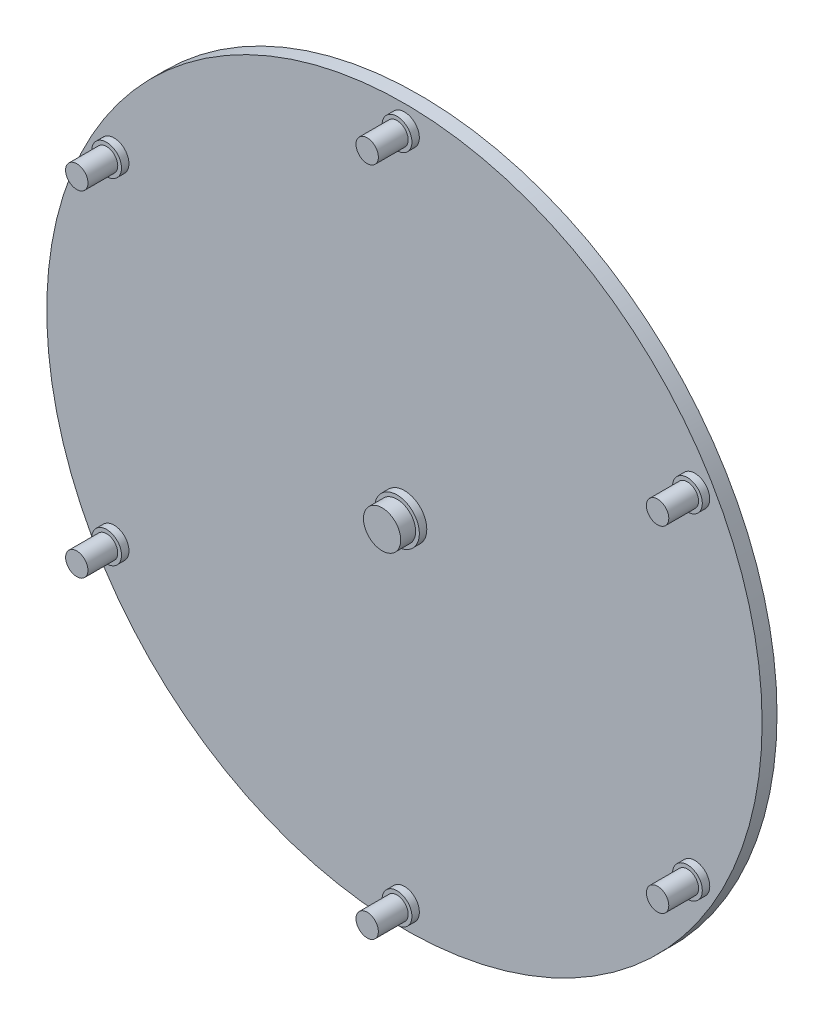
ISO-10303-21;
HEADER;
FILE_DESCRIPTION(('STEP AP214'),'2;1');
FILE_NAME('part.step','',(''),(''),'','','');
FILE_SCHEMA(('AUTOMOTIVE_DESIGN { 1 0 10303 214 1 1 1 1 }'));
ENDSEC;
DATA;
#1=APPLICATION_CONTEXT('core data for automotive mechanical design processes');
#2=APPLICATION_PROTOCOL_DEFINITION('international standard','automotive_design',2000,#1);
#3=PRODUCT_CONTEXT('',#1,'mechanical');
#4=PRODUCT('Part','Part','',(#3));
#5=PRODUCT_RELATED_PRODUCT_CATEGORY('part','',(#4));
#6=PRODUCT_DEFINITION_FORMATION('','',#4);
#7=PRODUCT_DEFINITION_CONTEXT('part definition',#1,'design');
#8=PRODUCT_DEFINITION('design','',#6,#7);
#9=PRODUCT_DEFINITION_SHAPE('','',#8);
#10=(LENGTH_UNIT() NAMED_UNIT(*) SI_UNIT(.MILLI.,.METRE.));
#11=(NAMED_UNIT(*) PLANE_ANGLE_UNIT() SI_UNIT($,.RADIAN.));
#12=(NAMED_UNIT(*) SI_UNIT($,.STERADIAN.) SOLID_ANGLE_UNIT());
#13=UNCERTAINTY_MEASURE_WITH_UNIT(LENGTH_MEASURE(1.E-05),#10,'distance_accuracy_value','');
#14=(GEOMETRIC_REPRESENTATION_CONTEXT(3) GLOBAL_UNCERTAINTY_ASSIGNED_CONTEXT((#13)) GLOBAL_UNIT_ASSIGNED_CONTEXT((#10,
#11,#12)) REPRESENTATION_CONTEXT('',''));
#15=CARTESIAN_POINT('',(0.,0.,0.));
#16=DIRECTION('',(0.,0.,1.));
#17=DIRECTION('',(1.,0.,0.));
#18=AXIS2_PLACEMENT_3D('',#15,#16,#17);
#19=CARTESIAN_POINT('',(0.,0.,4.));
#20=DIRECTION('',(0.,0.,-1.));
#21=DIRECTION('',(-1.,0.,0.));
#22=AXIS2_PLACEMENT_3D('',#19,#20,#21);
#23=CYLINDRICAL_SURFACE('',#22,96.);
#24=CARTESIAN_POINT('',(0.,0.,4.));
#25=DIRECTION('',(0.,0.,1.));
#26=DIRECTION('',(1.,0.,0.));
#27=AXIS2_PLACEMENT_3D('',#24,#25,#26);
#28=CIRCLE('',#27,96.);
#29=CARTESIAN_POINT('',(96.,0.,4.));
#30=VERTEX_POINT('',#29);
#31=EDGE_CURVE('E55',#30,#30,#28,.T.);
#32=ORIENTED_EDGE('',*,*,#31,.F.);
#33=EDGE_LOOP('',(#32));
#34=FACE_BOUND('',#33,.T.);
#35=CARTESIAN_POINT('',(0.,0.,0.));
#36=DIRECTION('',(0.,0.,1.));
#37=DIRECTION('',(1.,0.,0.));
#38=AXIS2_PLACEMENT_3D('',#35,#36,#37);
#39=CIRCLE('',#38,96.);
#40=CARTESIAN_POINT('',(96.,0.,0.));
#41=VERTEX_POINT('',#40);
#42=EDGE_CURVE('E59',#41,#41,#39,.T.);
#43=ORIENTED_EDGE('',*,*,#42,.T.);
#44=EDGE_LOOP('',(#43));
#45=FACE_BOUND('',#44,.T.);
#46=ADVANCED_FACE('F45',(#34,#45),#23,.T.);
#47=CARTESIAN_POINT('',(0.,0.,4.));
#48=DIRECTION('',(0.,0.,1.));
#49=DIRECTION('',(1.,0.,0.));
#50=AXIS2_PLACEMENT_3D('',#47,#48,#49);
#51=PLANE('',#50);
#52=CARTESIAN_POINT('',(-77.942286340599,45.0000000000009,4.));
#53=DIRECTION('',(0.,0.,1.));
#54=DIRECTION('',(0.50000000000001,0.866025403784433,0.));
#55=AXIS2_PLACEMENT_3D('',#52,#53,#54);
#56=CIRCLE('',#55,4.00000000000001);
#57=CARTESIAN_POINT('',(-75.9422863405989,48.4641016151386,4.));
#58=VERTEX_POINT('',#57);
#59=EDGE_CURVE('E143',#58,#58,#56,.T.);
#60=ORIENTED_EDGE('',*,*,#59,.F.);
#61=EDGE_LOOP('',(#60));
#62=FACE_BOUND('',#61,.T.);
#63=CARTESIAN_POINT('',(-77.9422863405999,-44.9999999999993,4.));
#64=DIRECTION('',(0.,0.,1.));
#65=DIRECTION('',(-0.499999999999992,0.866025403784443,0.));
#66=AXIS2_PLACEMENT_3D('',#63,#64,#65);
#67=CIRCLE('',#66,4.00000000000001);
#68=CARTESIAN_POINT('',(-79.9422863405999,-41.5358983848615,4.));
#69=VERTEX_POINT('',#68);
#70=EDGE_CURVE('E65',#69,#69,#67,.T.);
#71=ORIENTED_EDGE('',*,*,#70,.F.);
#72=EDGE_LOOP('',(#71));
#73=FACE_BOUND('',#72,.T.);
#74=CARTESIAN_POINT('',(0.,-90.,4.));
#75=DIRECTION('',(0.,0.,1.));
#76=DIRECTION('',(-1.,0.,0.));
#77=AXIS2_PLACEMENT_3D('',#74,#75,#76);
#78=CIRCLE('',#77,4.00000000000001);
#79=CARTESIAN_POINT('',(-4.00000000000001,-90.,4.));
#80=VERTEX_POINT('',#79);
#81=EDGE_CURVE('E70',#80,#80,#78,.T.);
#82=ORIENTED_EDGE('',*,*,#81,.F.);
#83=EDGE_LOOP('',(#82));
#84=FACE_BOUND('',#83,.T.);
#85=CARTESIAN_POINT('',(77.9422863405993,-45.0000000000004,4.));
#86=DIRECTION('',(0.,0.,1.));
#87=DIRECTION('',(-0.500000000000004,-0.866025403784436,0.));
#88=AXIS2_PLACEMENT_3D('',#85,#86,#87);
#89=CIRCLE('',#88,4.00000000000001);
#90=CARTESIAN_POINT('',(75.9422863405993,-48.4641016151381,4.));
#91=VERTEX_POINT('',#90);
#92=EDGE_CURVE('E75',#91,#91,#89,.T.);
#93=ORIENTED_EDGE('',*,*,#92,.F.);
#94=EDGE_LOOP('',(#93));
#95=FACE_BOUND('',#94,.T.);
#96=CARTESIAN_POINT('',(77.9422863405996,44.9999999999998,4.));
#97=DIRECTION('',(0.,0.,1.));
#98=DIRECTION('',(0.499999999999998,-0.86602540378444,0.));
#99=AXIS2_PLACEMENT_3D('',#96,#97,#98);
#100=CIRCLE('',#99,4.00000000000001);
#101=CARTESIAN_POINT('',(79.9422863405996,41.5358983848621,4.));
#102=VERTEX_POINT('',#101);
#103=EDGE_CURVE('E80',#102,#102,#100,.T.);
#104=ORIENTED_EDGE('',*,*,#103,.F.);
#105=EDGE_LOOP('',(#104));
#106=FACE_BOUND('',#105,.T.);
#107=CARTESIAN_POINT('',(0.,90.,4.));
#108=DIRECTION('',(0.,0.,1.));
#109=DIRECTION('',(1.,0.,0.));
#110=AXIS2_PLACEMENT_3D('',#107,#108,#109);
#111=CIRCLE('',#110,4.00000000000001);
#112=CARTESIAN_POINT('',(4.00000000000001,90.,4.));
#113=VERTEX_POINT('',#112);
#114=EDGE_CURVE('E85',#113,#113,#111,.T.);
#115=ORIENTED_EDGE('',*,*,#114,.F.);
#116=EDGE_LOOP('',(#115));
#117=FACE_BOUND('',#116,.T.);
#118=CARTESIAN_POINT('',(0.,0.,4.));
#119=DIRECTION('',(0.,0.,1.));
#120=DIRECTION('',(1.,0.,0.));
#121=AXIS2_PLACEMENT_3D('',#118,#119,#120);
#122=CIRCLE('',#121,6.);
#123=CARTESIAN_POINT('',(6.,0.,4.));
#124=VERTEX_POINT('',#123);
#125=EDGE_CURVE('E90',#124,#124,#122,.T.);
#126=ORIENTED_EDGE('',*,*,#125,.F.);
#127=EDGE_LOOP('',(#126));
#128=FACE_BOUND('',#127,.T.);
#129=ORIENTED_EDGE('',*,*,#31,.T.);
#130=EDGE_LOOP('',(#129));
#131=FACE_BOUND('',#130,.T.);
#132=ADVANCED_FACE('F181',(#62,#73,#84,#95,#106,#117,#128,#131),#51,.T.);
#133=CARTESIAN_POINT('',(0.,0.,0.));
#134=DIRECTION('',(0.,0.,1.));
#135=DIRECTION('',(1.,0.,0.));
#136=AXIS2_PLACEMENT_3D('',#133,#134,#135);
#137=PLANE('',#136);
#138=CARTESIAN_POINT('',(0.,0.,0.));
#139=DIRECTION('',(0.,0.,1.));
#140=DIRECTION('',(1.,0.,0.));
#141=AXIS2_PLACEMENT_3D('',#138,#139,#140);
#142=CIRCLE('',#141,7.);
#143=CARTESIAN_POINT('',(7.,0.,0.));
#144=VERTEX_POINT('',#143);
#145=EDGE_CURVE('E51',#144,#144,#142,.F.);
#146=ORIENTED_EDGE('',*,*,#145,.F.);
#147=EDGE_LOOP('',(#146));
#148=FACE_BOUND('',#147,.T.);
#149=ORIENTED_EDGE('',*,*,#42,.F.);
#150=EDGE_LOOP('',(#149));
#151=FACE_BOUND('',#150,.T.);
#152=ADVANCED_FACE('F187',(#148,#151),#137,.F.);
#153=CARTESIAN_POINT('',(0.,0.,6.));
#154=DIRECTION('',(0.,0.,-1.));
#155=DIRECTION('',(-1.,0.,0.));
#156=AXIS2_PLACEMENT_3D('',#153,#154,#155);
#157=CYLINDRICAL_SURFACE('',#156,6.);
#158=CARTESIAN_POINT('',(0.,0.,6.));
#159=DIRECTION('',(0.,0.,1.));
#160=DIRECTION('',(1.,0.,0.));
#161=AXIS2_PLACEMENT_3D('',#158,#159,#160);
#162=CIRCLE('',#161,6.);
#163=CARTESIAN_POINT('',(6.,0.,6.));
#164=VERTEX_POINT('',#163);
#165=EDGE_CURVE('E96',#164,#164,#162,.T.);
#166=ORIENTED_EDGE('',*,*,#165,.F.);
#167=EDGE_LOOP('',(#166));
#168=FACE_BOUND('',#167,.T.);
#169=ORIENTED_EDGE('',*,*,#125,.T.);
#170=EDGE_LOOP('',(#169));
#171=FACE_BOUND('',#170,.T.);
#172=ADVANCED_FACE('F195',(#168,#171),#157,.T.);
#173=CARTESIAN_POINT('',(0.,0.,6.));
#174=DIRECTION('',(0.,0.,1.));
#175=DIRECTION('',(1.,0.,0.));
#176=AXIS2_PLACEMENT_3D('',#173,#174,#175);
#177=PLANE('',#176);
#178=CARTESIAN_POINT('',(0.,0.,6.));
#179=DIRECTION('',(0.,0.,1.));
#180=DIRECTION('',(1.,0.,0.));
#181=AXIS2_PLACEMENT_3D('',#178,#179,#180);
#182=CIRCLE('',#181,5.);
#183=CARTESIAN_POINT('',(5.,0.,6.));
#184=VERTEX_POINT('',#183);
#185=EDGE_CURVE('E92',#184,#184,#182,.T.);
#186=ORIENTED_EDGE('',*,*,#185,.F.);
#187=EDGE_LOOP('',(#186));
#188=FACE_BOUND('',#187,.T.);
#189=ORIENTED_EDGE('',*,*,#165,.T.);
#190=EDGE_LOOP('',(#189));
#191=FACE_BOUND('',#190,.T.);
#192=ADVANCED_FACE('F202',(#188,#191),#177,.T.);
#193=CARTESIAN_POINT('',(0.,0.,10.));
#194=DIRECTION('',(0.,0.,1.));
#195=DIRECTION('',(1.,0.,0.));
#196=AXIS2_PLACEMENT_3D('',#193,#194,#195);
#197=PLANE('',#196);
#198=CARTESIAN_POINT('',(0.,0.,10.));
#199=DIRECTION('',(0.,0.,1.));
#200=DIRECTION('',(1.,0.,0.));
#201=AXIS2_PLACEMENT_3D('',#198,#199,#200);
#202=CIRCLE('',#201,5.);
#203=CARTESIAN_POINT('',(5.,0.,10.));
#204=VERTEX_POINT('',#203);
#205=EDGE_CURVE('E98',#204,#204,#202,.T.);
#206=ORIENTED_EDGE('',*,*,#205,.T.);
#207=EDGE_LOOP('',(#206));
#208=FACE_BOUND('',#207,.T.);
#209=ADVANCED_FACE('F210',(#208),#197,.T.);
#210=CARTESIAN_POINT('',(0.,0.,10.));
#211=DIRECTION('',(0.,0.,-1.));
#212=DIRECTION('',(-1.,0.,0.));
#213=AXIS2_PLACEMENT_3D('',#210,#211,#212);
#214=CYLINDRICAL_SURFACE('',#213,5.);
#215=ORIENTED_EDGE('',*,*,#185,.T.);
#216=EDGE_LOOP('',(#215));
#217=FACE_BOUND('',#216,.T.);
#218=ORIENTED_EDGE('',*,*,#205,.F.);
#219=EDGE_LOOP('',(#218));
#220=FACE_BOUND('',#219,.T.);
#221=ADVANCED_FACE('F206',(#217,#220),#214,.T.);
#222=CARTESIAN_POINT('',(0.,90.,6.));
#223=DIRECTION('',(0.,0.,-1.));
#224=DIRECTION('',(-1.,0.,0.));
#225=AXIS2_PLACEMENT_3D('',#222,#223,#224);
#226=CYLINDRICAL_SURFACE('',#225,4.00000000000001);
#227=CARTESIAN_POINT('',(0.,90.,6.));
#228=DIRECTION('',(0.,0.,1.));
#229=DIRECTION('',(1.,0.,0.));
#230=AXIS2_PLACEMENT_3D('',#227,#228,#229);
#231=CIRCLE('',#230,4.00000000000001);
#232=CARTESIAN_POINT('',(4.00000000000001,90.,6.));
#233=VERTEX_POINT('',#232);
#234=EDGE_CURVE('E91',#233,#233,#231,.T.);
#235=ORIENTED_EDGE('',*,*,#234,.F.);
#236=EDGE_LOOP('',(#235));
#237=FACE_BOUND('',#236,.T.);
#238=ORIENTED_EDGE('',*,*,#114,.T.);
#239=EDGE_LOOP('',(#238));
#240=FACE_BOUND('',#239,.T.);
#241=ADVANCED_FACE('F209',(#237,#240),#226,.T.);
#242=CARTESIAN_POINT('',(0.,90.,6.));
#243=DIRECTION('',(0.,0.,1.));
#244=DIRECTION('',(1.,0.,0.));
#245=AXIS2_PLACEMENT_3D('',#242,#243,#244);
#246=PLANE('',#245);
#247=CARTESIAN_POINT('',(0.,90.,6.));
#248=DIRECTION('',(0.,0.,1.));
#249=DIRECTION('',(1.,0.,0.));
#250=AXIS2_PLACEMENT_3D('',#247,#248,#249);
#251=CIRCLE('',#250,3.);
#252=CARTESIAN_POINT('',(3.,90.,6.));
#253=VERTEX_POINT('',#252);
#254=EDGE_CURVE('E87',#253,#253,#251,.T.);
#255=ORIENTED_EDGE('',*,*,#254,.F.);
#256=EDGE_LOOP('',(#255));
#257=FACE_BOUND('',#256,.T.);
#258=ORIENTED_EDGE('',*,*,#234,.T.);
#259=EDGE_LOOP('',(#258));
#260=FACE_BOUND('',#259,.T.);
#261=ADVANCED_FACE('F222',(#257,#260),#246,.T.);
#262=CARTESIAN_POINT('',(0.,90.,14.));
#263=DIRECTION('',(0.,0.,1.));
#264=DIRECTION('',(1.,0.,0.));
#265=AXIS2_PLACEMENT_3D('',#262,#263,#264);
#266=PLANE('',#265);
#267=CARTESIAN_POINT('',(0.,90.,14.));
#268=DIRECTION('',(0.,0.,1.));
#269=DIRECTION('',(1.,0.,0.));
#270=AXIS2_PLACEMENT_3D('',#267,#268,#269);
#271=CIRCLE('',#270,3.);
#272=CARTESIAN_POINT('',(3.,90.,14.));
#273=VERTEX_POINT('',#272);
#274=EDGE_CURVE('E102',#273,#273,#271,.T.);
#275=ORIENTED_EDGE('',*,*,#274,.T.);
#276=EDGE_LOOP('',(#275));
#277=FACE_BOUND('',#276,.T.);
#278=ADVANCED_FACE('F218',(#277),#266,.T.);
#279=CARTESIAN_POINT('',(0.,90.,14.));
#280=DIRECTION('',(0.,0.,-1.));
#281=DIRECTION('',(-1.,0.,0.));
#282=AXIS2_PLACEMENT_3D('',#279,#280,#281);
#283=CYLINDRICAL_SURFACE('',#282,3.);
#284=ORIENTED_EDGE('',*,*,#254,.T.);
#285=EDGE_LOOP('',(#284));
#286=FACE_BOUND('',#285,.T.);
#287=ORIENTED_EDGE('',*,*,#274,.F.);
#288=EDGE_LOOP('',(#287));
#289=FACE_BOUND('',#288,.T.);
#290=ADVANCED_FACE('F214',(#286,#289),#283,.T.);
#291=CARTESIAN_POINT('',(77.9422863405996,44.9999999999998,6.));
#292=DIRECTION('',(0.,0.,-1.));
#293=DIRECTION('',(-1.,0.,0.));
#294=AXIS2_PLACEMENT_3D('',#291,#292,#293);
#295=CYLINDRICAL_SURFACE('',#294,4.00000000000001);
#296=CARTESIAN_POINT('',(77.9422863405996,44.9999999999998,6.));
#297=DIRECTION('',(0.,0.,1.));
#298=DIRECTION('',(0.499999999999998,-0.86602540378444,0.));
#299=AXIS2_PLACEMENT_3D('',#296,#297,#298);
#300=CIRCLE('',#299,4.00000000000001);
#301=CARTESIAN_POINT('',(79.9422863405996,41.5358983848621,6.));
#302=VERTEX_POINT('',#301);
#303=EDGE_CURVE('E86',#302,#302,#300,.T.);
#304=ORIENTED_EDGE('',*,*,#303,.F.);
#305=EDGE_LOOP('',(#304));
#306=FACE_BOUND('',#305,.T.);
#307=ORIENTED_EDGE('',*,*,#103,.T.);
#308=EDGE_LOOP('',(#307));
#309=FACE_BOUND('',#308,.T.);
#310=ADVANCED_FACE('F217',(#306,#309),#295,.T.);
#311=CARTESIAN_POINT('',(77.9422863405996,44.9999999999998,6.));
#312=DIRECTION('',(0.,0.,1.));
#313=DIRECTION('',(0.499999999999998,-0.86602540378444,0.));
#314=AXIS2_PLACEMENT_3D('',#311,#312,#313);
#315=PLANE('',#314);
#316=CARTESIAN_POINT('',(77.942286340599,45.0000000000009,6.));
#317=DIRECTION('',(0.,0.,1.));
#318=DIRECTION('',(1.,0.,0.));
#319=AXIS2_PLACEMENT_3D('',#316,#317,#318);
#320=CIRCLE('',#319,3.);
#321=CARTESIAN_POINT('',(80.942286340599,45.0000000000009,6.));
#322=VERTEX_POINT('',#321);
#323=EDGE_CURVE('E82',#322,#322,#320,.T.);
#324=ORIENTED_EDGE('',*,*,#323,.F.);
#325=EDGE_LOOP('',(#324));
#326=FACE_BOUND('',#325,.T.);
#327=ORIENTED_EDGE('',*,*,#303,.T.);
#328=EDGE_LOOP('',(#327));
#329=FACE_BOUND('',#328,.T.);
#330=ADVANCED_FACE('F269',(#326,#329),#315,.T.);
#331=CARTESIAN_POINT('',(77.942286340599,45.0000000000009,14.));
#332=DIRECTION('',(0.,0.,1.));
#333=DIRECTION('',(0.50000000000001,-0.866025403784433,0.));
#334=AXIS2_PLACEMENT_3D('',#331,#332,#333);
#335=PLANE('',#334);
#336=CARTESIAN_POINT('',(77.942286340599,45.0000000000009,14.));
#337=DIRECTION('',(0.,0.,1.));
#338=DIRECTION('',(0.50000000000001,-0.866025403784433,0.));
#339=AXIS2_PLACEMENT_3D('',#336,#337,#338);
#340=CIRCLE('',#339,3.);
#341=CARTESIAN_POINT('',(79.442286340599,42.4019237886476,14.));
#342=VERTEX_POINT('',#341);
#343=EDGE_CURVE('E95',#342,#342,#340,.T.);
#344=ORIENTED_EDGE('',*,*,#343,.T.);
#345=EDGE_LOOP('',(#344));
#346=FACE_BOUND('',#345,.T.);
#347=ADVANCED_FACE('F266',(#346),#335,.T.);
#348=CARTESIAN_POINT('',(77.942286340599,45.0000000000009,14.));
#349=DIRECTION('',(0.,0.,-1.));
#350=DIRECTION('',(-1.,0.,0.));
#351=AXIS2_PLACEMENT_3D('',#348,#349,#350);
#352=CYLINDRICAL_SURFACE('',#351,3.);
#353=ORIENTED_EDGE('',*,*,#323,.T.);
#354=EDGE_LOOP('',(#353));
#355=FACE_BOUND('',#354,.T.);
#356=ORIENTED_EDGE('',*,*,#343,.F.);
#357=EDGE_LOOP('',(#356));
#358=FACE_BOUND('',#357,.T.);
#359=ADVANCED_FACE('F262',(#355,#358),#352,.T.);
#360=CARTESIAN_POINT('',(77.9422863405993,-45.0000000000004,6.));
#361=DIRECTION('',(0.,0.,-1.));
#362=DIRECTION('',(-1.,0.,0.));
#363=AXIS2_PLACEMENT_3D('',#360,#361,#362);
#364=CYLINDRICAL_SURFACE('',#363,4.00000000000001);
#365=CARTESIAN_POINT('',(77.9422863405993,-45.0000000000004,6.));
#366=DIRECTION('',(0.,0.,1.));
#367=DIRECTION('',(-0.500000000000004,-0.866025403784436,0.));
#368=AXIS2_PLACEMENT_3D('',#365,#366,#367);
#369=CIRCLE('',#368,4.00000000000001);
#370=CARTESIAN_POINT('',(75.9422863405993,-48.4641016151381,6.));
#371=VERTEX_POINT('',#370);
#372=EDGE_CURVE('E81',#371,#371,#369,.T.);
#373=ORIENTED_EDGE('',*,*,#372,.F.);
#374=EDGE_LOOP('',(#373));
#375=FACE_BOUND('',#374,.T.);
#376=ORIENTED_EDGE('',*,*,#92,.T.);
#377=EDGE_LOOP('',(#376));
#378=FACE_BOUND('',#377,.T.);
#379=ADVANCED_FACE('F265',(#375,#378),#364,.T.);
#380=CARTESIAN_POINT('',(77.9422863405993,-45.0000000000004,6.));
#381=DIRECTION('',(0.,0.,1.));
#382=DIRECTION('',(-0.500000000000004,-0.866025403784436,0.));
#383=AXIS2_PLACEMENT_3D('',#380,#381,#382);
#384=PLANE('',#383);
#385=CARTESIAN_POINT('',(77.9422863405999,-44.9999999999993,6.));
#386=DIRECTION('',(0.,0.,1.));
#387=DIRECTION('',(1.,0.,0.));
#388=AXIS2_PLACEMENT_3D('',#385,#386,#387);
#389=CIRCLE('',#388,3.);
#390=CARTESIAN_POINT('',(80.9422863405999,-44.9999999999993,6.));
#391=VERTEX_POINT('',#390);
#392=EDGE_CURVE('E77',#391,#391,#389,.T.);
#393=ORIENTED_EDGE('',*,*,#392,.F.);
#394=EDGE_LOOP('',(#393));
#395=FACE_BOUND('',#394,.T.);
#396=ORIENTED_EDGE('',*,*,#372,.T.);
#397=EDGE_LOOP('',(#396));
#398=FACE_BOUND('',#397,.T.);
#399=ADVANCED_FACE('F260',(#395,#398),#384,.T.);
#400=CARTESIAN_POINT('',(77.9422863405999,-44.9999999999993,14.));
#401=DIRECTION('',(0.,0.,1.));
#402=DIRECTION('',(-0.499999999999992,-0.866025403784443,0.));
#403=AXIS2_PLACEMENT_3D('',#400,#401,#402);
#404=PLANE('',#403);
#405=CARTESIAN_POINT('',(77.9422863405999,-44.9999999999993,14.));
#406=DIRECTION('',(0.,0.,1.));
#407=DIRECTION('',(-0.499999999999992,-0.866025403784443,0.));
#408=AXIS2_PLACEMENT_3D('',#405,#406,#407);
#409=CIRCLE('',#408,3.);
#410=CARTESIAN_POINT('',(76.4422863405999,-47.5980762113526,14.));
#411=VERTEX_POINT('',#410);
#412=EDGE_CURVE('E114',#411,#411,#409,.T.);
#413=ORIENTED_EDGE('',*,*,#412,.T.);
#414=EDGE_LOOP('',(#413));
#415=FACE_BOUND('',#414,.T.);
#416=ADVANCED_FACE('F256',(#415),#404,.T.);
#417=CARTESIAN_POINT('',(77.9422863405999,-44.9999999999993,14.));
#418=DIRECTION('',(0.,0.,-1.));
#419=DIRECTION('',(-1.,0.,0.));
#420=AXIS2_PLACEMENT_3D('',#417,#418,#419);
#421=CYLINDRICAL_SURFACE('',#420,3.);
#422=ORIENTED_EDGE('',*,*,#392,.T.);
#423=EDGE_LOOP('',(#422));
#424=FACE_BOUND('',#423,.T.);
#425=ORIENTED_EDGE('',*,*,#412,.F.);
#426=EDGE_LOOP('',(#425));
#427=FACE_BOUND('',#426,.T.);
#428=ADVANCED_FACE('F252',(#424,#427),#421,.T.);
#429=CARTESIAN_POINT('',(0.,-90.,6.));
#430=DIRECTION('',(0.,0.,-1.));
#431=DIRECTION('',(-1.,0.,0.));
#432=AXIS2_PLACEMENT_3D('',#429,#430,#431);
#433=CYLINDRICAL_SURFACE('',#432,4.00000000000001);
#434=CARTESIAN_POINT('',(0.,-90.,6.));
#435=DIRECTION('',(0.,0.,1.));
#436=DIRECTION('',(-1.,0.,0.));
#437=AXIS2_PLACEMENT_3D('',#434,#435,#436);
#438=CIRCLE('',#437,4.00000000000001);
#439=CARTESIAN_POINT('',(-4.00000000000001,-90.,6.));
#440=VERTEX_POINT('',#439);
#441=EDGE_CURVE('E76',#440,#440,#438,.T.);
#442=ORIENTED_EDGE('',*,*,#441,.F.);
#443=EDGE_LOOP('',(#442));
#444=FACE_BOUND('',#443,.T.);
#445=ORIENTED_EDGE('',*,*,#81,.T.);
#446=EDGE_LOOP('',(#445));
#447=FACE_BOUND('',#446,.T.);
#448=ADVANCED_FACE('F255',(#444,#447),#433,.T.);
#449=CARTESIAN_POINT('',(0.,-90.,6.));
#450=DIRECTION('',(0.,0.,1.));
#451=DIRECTION('',(-1.,0.,0.));
#452=AXIS2_PLACEMENT_3D('',#449,#450,#451);
#453=PLANE('',#452);
#454=CARTESIAN_POINT('',(0.,-90.,6.));
#455=DIRECTION('',(0.,0.,1.));
#456=DIRECTION('',(1.,0.,0.));
#457=AXIS2_PLACEMENT_3D('',#454,#455,#456);
#458=CIRCLE('',#457,3.);
#459=CARTESIAN_POINT('',(3.,-90.,6.));
#460=VERTEX_POINT('',#459);
#461=EDGE_CURVE('E72',#460,#460,#458,.T.);
#462=ORIENTED_EDGE('',*,*,#461,.F.);
#463=EDGE_LOOP('',(#462));
#464=FACE_BOUND('',#463,.T.);
#465=ORIENTED_EDGE('',*,*,#441,.T.);
#466=EDGE_LOOP('',(#465));
#467=FACE_BOUND('',#466,.T.);
#468=ADVANCED_FACE('F250',(#464,#467),#453,.T.);
#469=CARTESIAN_POINT('',(0.,-90.,14.));
#470=DIRECTION('',(0.,0.,1.));
#471=DIRECTION('',(-1.,0.,0.));
#472=AXIS2_PLACEMENT_3D('',#469,#470,#471);
#473=PLANE('',#472);
#474=CARTESIAN_POINT('',(0.,-90.,14.));
#475=DIRECTION('',(0.,0.,1.));
#476=DIRECTION('',(-1.,0.,0.));
#477=AXIS2_PLACEMENT_3D('',#474,#475,#476);
#478=CIRCLE('',#477,3.);
#479=CARTESIAN_POINT('',(-3.,-90.,14.));
#480=VERTEX_POINT('',#479);
#481=EDGE_CURVE('E111',#480,#480,#478,.T.);
#482=ORIENTED_EDGE('',*,*,#481,.T.);
#483=EDGE_LOOP('',(#482));
#484=FACE_BOUND('',#483,.T.);
#485=ADVANCED_FACE('F246',(#484),#473,.T.);
#486=CARTESIAN_POINT('',(0.,-90.,14.));
#487=DIRECTION('',(0.,0.,-1.));
#488=DIRECTION('',(-1.,0.,0.));
#489=AXIS2_PLACEMENT_3D('',#486,#487,#488);
#490=CYLINDRICAL_SURFACE('',#489,3.);
#491=ORIENTED_EDGE('',*,*,#461,.T.);
#492=EDGE_LOOP('',(#491));
#493=FACE_BOUND('',#492,.T.);
#494=ORIENTED_EDGE('',*,*,#481,.F.);
#495=EDGE_LOOP('',(#494));
#496=FACE_BOUND('',#495,.T.);
#497=ADVANCED_FACE('F242',(#493,#496),#490,.T.);
#498=CARTESIAN_POINT('',(-77.9422863405999,-44.9999999999993,6.));
#499=DIRECTION('',(0.,0.,-1.));
#500=DIRECTION('',(-1.,0.,0.));
#501=AXIS2_PLACEMENT_3D('',#498,#499,#500);
#502=CYLINDRICAL_SURFACE('',#501,4.00000000000001);
#503=CARTESIAN_POINT('',(-77.9422863405999,-44.9999999999993,6.));
#504=DIRECTION('',(0.,0.,1.));
#505=DIRECTION('',(-0.499999999999992,0.866025403784443,0.));
#506=AXIS2_PLACEMENT_3D('',#503,#504,#505);
#507=CIRCLE('',#506,4.00000000000001);
#508=CARTESIAN_POINT('',(-79.9422863405999,-41.5358983848615,6.));
#509=VERTEX_POINT('',#508);
#510=EDGE_CURVE('E71',#509,#509,#507,.T.);
#511=ORIENTED_EDGE('',*,*,#510,.F.);
#512=EDGE_LOOP('',(#511));
#513=FACE_BOUND('',#512,.T.);
#514=ORIENTED_EDGE('',*,*,#70,.T.);
#515=EDGE_LOOP('',(#514));
#516=FACE_BOUND('',#515,.T.);
#517=ADVANCED_FACE('F245',(#513,#516),#502,.T.);
#518=CARTESIAN_POINT('',(-77.9422863405999,-44.9999999999993,6.));
#519=DIRECTION('',(0.,0.,1.));
#520=DIRECTION('',(-0.499999999999992,0.866025403784443,0.));
#521=AXIS2_PLACEMENT_3D('',#518,#519,#520);
#522=PLANE('',#521);
#523=CARTESIAN_POINT('',(-77.9422863405993,-45.0000000000004,6.));
#524=DIRECTION('',(0.,0.,1.));
#525=DIRECTION('',(1.,0.,0.));
#526=AXIS2_PLACEMENT_3D('',#523,#524,#525);
#527=CIRCLE('',#526,3.);
#528=CARTESIAN_POINT('',(-74.9422863405993,-45.0000000000004,6.));
#529=VERTEX_POINT('',#528);
#530=EDGE_CURVE('E67',#529,#529,#527,.T.);
#531=ORIENTED_EDGE('',*,*,#530,.F.);
#532=EDGE_LOOP('',(#531));
#533=FACE_BOUND('',#532,.T.);
#534=ORIENTED_EDGE('',*,*,#510,.T.);
#535=EDGE_LOOP('',(#534));
#536=FACE_BOUND('',#535,.T.);
#537=ADVANCED_FACE('F240',(#533,#536),#522,.T.);
#538=CARTESIAN_POINT('',(-77.9422863405993,-45.0000000000004,14.));
#539=DIRECTION('',(0.,0.,1.));
#540=DIRECTION('',(-0.500000000000004,0.866025403784436,0.));
#541=AXIS2_PLACEMENT_3D('',#538,#539,#540);
#542=PLANE('',#541);
#543=CARTESIAN_POINT('',(-77.9422863405993,-45.0000000000004,14.));
#544=DIRECTION('',(0.,0.,1.));
#545=DIRECTION('',(-0.500000000000004,0.866025403784436,0.));
#546=AXIS2_PLACEMENT_3D('',#543,#544,#545);
#547=CIRCLE('',#546,3.);
#548=CARTESIAN_POINT('',(-79.4422863405993,-42.4019237886471,14.));
#549=VERTEX_POINT('',#548);
#550=EDGE_CURVE('E108',#549,#549,#547,.T.);
#551=ORIENTED_EDGE('',*,*,#550,.T.);
#552=EDGE_LOOP('',(#551));
#553=FACE_BOUND('',#552,.T.);
#554=ADVANCED_FACE('F236',(#553),#542,.T.);
#555=CARTESIAN_POINT('',(-77.9422863405993,-45.0000000000004,14.));
#556=DIRECTION('',(0.,0.,-1.));
#557=DIRECTION('',(-1.,0.,0.));
#558=AXIS2_PLACEMENT_3D('',#555,#556,#557);
#559=CYLINDRICAL_SURFACE('',#558,3.);
#560=ORIENTED_EDGE('',*,*,#530,.T.);
#561=EDGE_LOOP('',(#560));
#562=FACE_BOUND('',#561,.T.);
#563=ORIENTED_EDGE('',*,*,#550,.F.);
#564=EDGE_LOOP('',(#563));
#565=FACE_BOUND('',#564,.T.);
#566=ADVANCED_FACE('F232',(#562,#565),#559,.T.);
#567=CARTESIAN_POINT('',(-77.942286340599,45.0000000000009,6.));
#568=DIRECTION('',(0.,0.,-1.));
#569=DIRECTION('',(-1.,0.,0.));
#570=AXIS2_PLACEMENT_3D('',#567,#568,#569);
#571=CYLINDRICAL_SURFACE('',#570,4.00000000000001);
#572=CARTESIAN_POINT('',(-77.942286340599,45.0000000000009,6.));
#573=DIRECTION('',(0.,0.,1.));
#574=DIRECTION('',(0.50000000000001,0.866025403784433,0.));
#575=AXIS2_PLACEMENT_3D('',#572,#573,#574);
#576=CIRCLE('',#575,4.00000000000001);
#577=CARTESIAN_POINT('',(-75.9422863405989,48.4641016151386,6.));
#578=VERTEX_POINT('',#577);
#579=EDGE_CURVE('E66',#578,#578,#576,.T.);
#580=ORIENTED_EDGE('',*,*,#579,.F.);
#581=EDGE_LOOP('',(#580));
#582=FACE_BOUND('',#581,.T.);
#583=ORIENTED_EDGE('',*,*,#59,.T.);
#584=EDGE_LOOP('',(#583));
#585=FACE_BOUND('',#584,.T.);
#586=ADVANCED_FACE('F235',(#582,#585),#571,.T.);
#587=CARTESIAN_POINT('',(-77.942286340599,45.0000000000009,6.));
#588=DIRECTION('',(0.,0.,1.));
#589=DIRECTION('',(0.50000000000001,0.866025403784433,0.));
#590=AXIS2_PLACEMENT_3D('',#587,#588,#589);
#591=PLANE('',#590);
#592=CARTESIAN_POINT('',(-77.9422863405996,44.9999999999998,6.));
#593=DIRECTION('',(0.,0.,1.));
#594=DIRECTION('',(1.,0.,0.));
#595=AXIS2_PLACEMENT_3D('',#592,#593,#594);
#596=CIRCLE('',#595,3.);
#597=CARTESIAN_POINT('',(-74.9422863405996,44.9999999999998,6.));
#598=VERTEX_POINT('',#597);
#599=EDGE_CURVE('E62',#598,#598,#596,.T.);
#600=ORIENTED_EDGE('',*,*,#599,.F.);
#601=EDGE_LOOP('',(#600));
#602=FACE_BOUND('',#601,.T.);
#603=ORIENTED_EDGE('',*,*,#579,.T.);
#604=EDGE_LOOP('',(#603));
#605=FACE_BOUND('',#604,.T.);
#606=ADVANCED_FACE('F230',(#602,#605),#591,.T.);
#607=CARTESIAN_POINT('',(-77.9422863405996,44.9999999999998,14.));
#608=DIRECTION('',(0.,0.,1.));
#609=DIRECTION('',(0.499999999999998,0.86602540378444,0.));
#610=AXIS2_PLACEMENT_3D('',#607,#608,#609);
#611=PLANE('',#610);
#612=CARTESIAN_POINT('',(-77.9422863405996,44.9999999999998,14.));
#613=DIRECTION('',(0.,0.,1.));
#614=DIRECTION('',(0.499999999999998,0.86602540378444,0.));
#615=AXIS2_PLACEMENT_3D('',#612,#613,#614);
#616=CIRCLE('',#615,3.);
#617=CARTESIAN_POINT('',(-76.4422863405996,47.5980762113531,14.));
#618=VERTEX_POINT('',#617);
#619=EDGE_CURVE('E105',#618,#618,#616,.T.);
#620=ORIENTED_EDGE('',*,*,#619,.T.);
#621=EDGE_LOOP('',(#620));
#622=FACE_BOUND('',#621,.T.);
#623=ADVANCED_FACE('F226',(#622),#611,.T.);
#624=CARTESIAN_POINT('',(-77.9422863405996,44.9999999999998,14.));
#625=DIRECTION('',(0.,0.,-1.));
#626=DIRECTION('',(-1.,0.,0.));
#627=AXIS2_PLACEMENT_3D('',#624,#625,#626);
#628=CYLINDRICAL_SURFACE('',#627,3.);
#629=ORIENTED_EDGE('',*,*,#599,.T.);
#630=EDGE_LOOP('',(#629));
#631=FACE_BOUND('',#630,.T.);
#632=ORIENTED_EDGE('',*,*,#619,.F.);
#633=EDGE_LOOP('',(#632));
#634=FACE_BOUND('',#633,.T.);
#635=ADVANCED_FACE('F224',(#631,#634),#628,.T.);
#636=CARTESIAN_POINT('',(0.,0.,-8.));
#637=DIRECTION('',(0.,0.,1.));
#638=DIRECTION('',(1.,0.,0.));
#639=AXIS2_PLACEMENT_3D('',#636,#637,#638);
#640=CYLINDRICAL_SURFACE('',#639,7.);
#641=CARTESIAN_POINT('',(0.,0.,-8.));
#642=DIRECTION('',(0.,0.,-1.));
#643=DIRECTION('',(-1.,0.,0.));
#644=AXIS2_PLACEMENT_3D('',#641,#642,#643);
#645=CIRCLE('',#644,7.);
#646=CARTESIAN_POINT('',(-7.,0.,-8.));
#647=VERTEX_POINT('',#646);
#648=EDGE_CURVE('E146',#647,#647,#645,.T.);
#649=ORIENTED_EDGE('',*,*,#648,.F.);
#650=EDGE_LOOP('',(#649));
#651=FACE_BOUND('',#650,.T.);
#652=ORIENTED_EDGE('',*,*,#145,.T.);
#653=EDGE_LOOP('',(#652));
#654=FACE_BOUND('',#653,.T.);
#655=ADVANCED_FACE('F175',(#651,#654),#640,.T.);
#656=CARTESIAN_POINT('',(0.,0.,-8.));
#657=DIRECTION('',(0.,0.,-1.));
#658=DIRECTION('',(-1.,0.,0.));
#659=AXIS2_PLACEMENT_3D('',#656,#657,#658);
#660=PLANE('',#659);
#661=CARTESIAN_POINT('',(0.,0.,-8.));
#662=DIRECTION('',(0.,0.,-1.));
#663=DIRECTION('',(-1.,0.,0.));
#664=AXIS2_PLACEMENT_3D('',#661,#662,#663);
#665=CIRCLE('',#664,5.);
#666=CARTESIAN_POINT('',(-5.,0.,-8.));
#667=VERTEX_POINT('',#666);
#668=EDGE_CURVE('E152',#667,#667,#665,.T.);
#669=ORIENTED_EDGE('',*,*,#668,.F.);
#670=EDGE_LOOP('',(#669));
#671=FACE_BOUND('',#670,.T.);
#672=ORIENTED_EDGE('',*,*,#648,.T.);
#673=EDGE_LOOP('',(#672));
#674=FACE_BOUND('',#673,.T.);
#675=ADVANCED_FACE('F166',(#671,#674),#660,.T.);
#676=CARTESIAN_POINT('',(0.,0.,-23.));
#677=DIRECTION('',(0.,0.,-1.));
#678=DIRECTION('',(-1.,0.,0.));
#679=AXIS2_PLACEMENT_3D('',#676,#677,#678);
#680=PLANE('',#679);
#681=CARTESIAN_POINT('',(0.,0.,-23.));
#682=DIRECTION('',(0.,0.,-1.));
#683=DIRECTION('',(-1.,0.,0.));
#684=AXIS2_PLACEMENT_3D('',#681,#682,#683);
#685=CIRCLE('',#684,5.);
#686=CARTESIAN_POINT('',(-5.,0.,-23.));
#687=VERTEX_POINT('',#686);
#688=EDGE_CURVE('E151',#687,#687,#685,.T.);
#689=ORIENTED_EDGE('',*,*,#688,.T.);
#690=EDGE_LOOP('',(#689));
#691=FACE_BOUND('',#690,.T.);
#692=CARTESIAN_POINT('',(0.,0.,-23.));
#693=DIRECTION('',(0.,0.,-1.));
#694=DIRECTION('',(-1.,0.,0.));
#695=AXIS2_PLACEMENT_3D('',#692,#693,#694);
#696=CIRCLE('',#695,3.);
#697=CARTESIAN_POINT('',(-3.,0.,-23.));
#698=VERTEX_POINT('',#697);
#699=EDGE_CURVE('E155',#698,#698,#696,.T.);
#700=ORIENTED_EDGE('',*,*,#699,.F.);
#701=EDGE_LOOP('',(#700));
#702=FACE_BOUND('',#701,.T.);
#703=ADVANCED_FACE('F163',(#691,#702),#680,.T.);
#704=CARTESIAN_POINT('',(0.,0.,-23.));
#705=DIRECTION('',(0.,0.,1.));
#706=DIRECTION('',(1.,0.,0.));
#707=AXIS2_PLACEMENT_3D('',#704,#705,#706);
#708=CYLINDRICAL_SURFACE('',#707,5.);
#709=ORIENTED_EDGE('',*,*,#688,.F.);
#710=EDGE_LOOP('',(#709));
#711=FACE_BOUND('',#710,.T.);
#712=ORIENTED_EDGE('',*,*,#668,.T.);
#713=EDGE_LOOP('',(#712));
#714=FACE_BOUND('',#713,.T.);
#715=ADVANCED_FACE('F165',(#711,#714),#708,.T.);
#716=CARTESIAN_POINT('',(0.,0.,-23.));
#717=DIRECTION('',(0.,0.,1.));
#718=DIRECTION('',(1.,0.,0.));
#719=AXIS2_PLACEMENT_3D('',#716,#717,#718);
#720=CYLINDRICAL_SURFACE('',#719,3.);
#721=ORIENTED_EDGE('',*,*,#699,.T.);
#722=EDGE_LOOP('',(#721));
#723=FACE_BOUND('',#722,.T.);
#724=CARTESIAN_POINT('',(0.,0.,-8.));
#725=DIRECTION('',(0.,0.,-1.));
#726=DIRECTION('',(-1.,0.,0.));
#727=AXIS2_PLACEMENT_3D('',#724,#725,#726);
#728=CIRCLE('',#727,3.);
#729=CARTESIAN_POINT('',(-3.,0.,-8.));
#730=VERTEX_POINT('',#729);
#731=EDGE_CURVE('E11',#730,#730,#728,.F.);
#732=ORIENTED_EDGE('',*,*,#731,.T.);
#733=EDGE_LOOP('',(#732));
#734=FACE_BOUND('',#733,.T.);
#735=ADVANCED_FACE('F161',(#723,#734),#720,.F.);
#736=ORIENTED_EDGE('',*,*,#731,.F.);
#737=EDGE_LOOP('',(#736));
#738=FACE_BOUND('',#737,.T.);
#739=ADVANCED_FACE('F178',(#738),#660,.T.);
#740=CLOSED_SHELL('',(#46,#132,#152,#172,#192,#209,#221,#241,#261,#278,#290,#310,#330,#347,#359,
#379,#399,#416,#428,#448,#468,#485,#497,#517,#537,#554,#566,#586,#606,#623,#635,#655,#675,#703,
#715,#735,#739));
#741=MANIFOLD_SOLID_BREP('B2',#740);
#742=ADVANCED_BREP_SHAPE_REPRESENTATION('',(#18,#741),#14);
#743=SHAPE_DEFINITION_REPRESENTATION(#9,#742);
ENDSEC;
END-ISO-10303-21;
